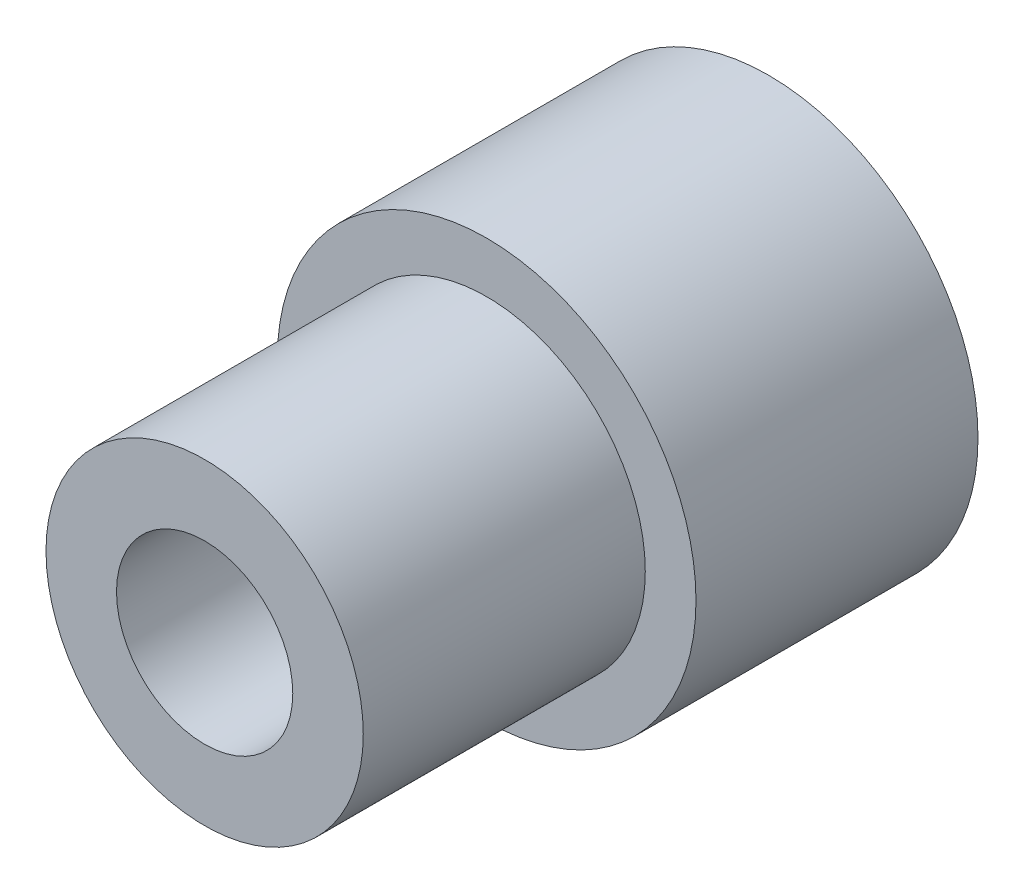
ISO-10303-21;
HEADER;
FILE_DESCRIPTION(('STEP AP214'),'2;1');
FILE_NAME('part.step','',(''),(''),'','','');
FILE_SCHEMA(('AUTOMOTIVE_DESIGN { 1 0 10303 214 1 1 1 1 }'));
ENDSEC;
DATA;
#1=APPLICATION_CONTEXT('core data for automotive mechanical design processes');
#2=APPLICATION_PROTOCOL_DEFINITION('international standard','automotive_design',2000,#1);
#3=PRODUCT_CONTEXT('',#1,'mechanical');
#4=PRODUCT('Part','Part','',(#3));
#5=PRODUCT_RELATED_PRODUCT_CATEGORY('part','',(#4));
#6=PRODUCT_DEFINITION_FORMATION('','',#4);
#7=PRODUCT_DEFINITION_CONTEXT('part definition',#1,'design');
#8=PRODUCT_DEFINITION('design','',#6,#7);
#9=PRODUCT_DEFINITION_SHAPE('','',#8);
#10=(LENGTH_UNIT() NAMED_UNIT(*) SI_UNIT(.MILLI.,.METRE.));
#11=(NAMED_UNIT(*) PLANE_ANGLE_UNIT() SI_UNIT($,.RADIAN.));
#12=(NAMED_UNIT(*) SI_UNIT($,.STERADIAN.) SOLID_ANGLE_UNIT());
#13=UNCERTAINTY_MEASURE_WITH_UNIT(LENGTH_MEASURE(1.E-05),#10,'distance_accuracy_value','');
#14=(GEOMETRIC_REPRESENTATION_CONTEXT(3) GLOBAL_UNCERTAINTY_ASSIGNED_CONTEXT((#13)) GLOBAL_UNIT_ASSIGNED_CONTEXT((#10,
#11,#12)) REPRESENTATION_CONTEXT('',''));
#15=CARTESIAN_POINT('',(0.,0.,0.));
#16=DIRECTION('',(0.,0.,1.));
#17=DIRECTION('',(1.,0.,0.));
#18=AXIS2_PLACEMENT_3D('',#15,#16,#17);
#19=CARTESIAN_POINT('',(0.,0.,5.08));
#20=DIRECTION('',(0.,0.,1.));
#21=DIRECTION('',(1.,0.,0.));
#22=AXIS2_PLACEMENT_3D('',#19,#20,#21);
#23=PLANE('',#22);
#24=CARTESIAN_POINT('',(0.,0.,5.08));
#25=DIRECTION('',(0.,0.,1.));
#26=DIRECTION('',(1.,0.,0.));
#27=AXIS2_PLACEMENT_3D('',#24,#25,#26);
#28=CIRCLE('',#27,2.8575);
#29=CARTESIAN_POINT('',(2.8575,0.,5.08));
#30=VERTEX_POINT('',#29);
#31=EDGE_CURVE('E50',#30,#30,#28,.T.);
#32=ORIENTED_EDGE('',*,*,#31,.F.);
#33=EDGE_LOOP('',(#32));
#34=FACE_BOUND('',#33,.T.);
#35=CARTESIAN_POINT('',(0.,0.,5.08));
#36=DIRECTION('',(0.,0.,1.));
#37=DIRECTION('',(1.,0.,0.));
#38=AXIS2_PLACEMENT_3D('',#35,#36,#37);
#39=CIRCLE('',#38,3.77063);
#40=CARTESIAN_POINT('',(3.77063,0.,5.08));
#41=VERTEX_POINT('',#40);
#42=EDGE_CURVE('E10',#41,#41,#39,.T.);
#43=ORIENTED_EDGE('',*,*,#42,.T.);
#44=EDGE_LOOP('',(#43));
#45=FACE_BOUND('',#44,.T.);
#46=ADVANCED_FACE('F31',(#34,#45),#23,.T.);
#47=CARTESIAN_POINT('',(0.,0.,0.));
#48=DIRECTION('',(0.,0.,1.));
#49=DIRECTION('',(1.,0.,0.));
#50=AXIS2_PLACEMENT_3D('',#47,#48,#49);
#51=PLANE('',#50);
#52=CARTESIAN_POINT('',(0.,0.,0.));
#53=DIRECTION('',(0.,0.,1.));
#54=DIRECTION('',(1.,0.,0.));
#55=AXIS2_PLACEMENT_3D('',#52,#53,#54);
#56=CIRCLE('',#55,3.77063);
#57=CARTESIAN_POINT('',(3.77063,0.,0.));
#58=VERTEX_POINT('',#57);
#59=EDGE_CURVE('E35',#58,#58,#56,.T.);
#60=ORIENTED_EDGE('',*,*,#59,.F.);
#61=EDGE_LOOP('',(#60));
#62=FACE_BOUND('',#61,.T.);
#63=CARTESIAN_POINT('',(0.,0.,0.));
#64=DIRECTION('',(0.,0.,1.));
#65=DIRECTION('',(1.,0.,0.));
#66=AXIS2_PLACEMENT_3D('',#63,#64,#65);
#67=CIRCLE('',#66,2.50063);
#68=CARTESIAN_POINT('',(2.50063,0.,0.));
#69=VERTEX_POINT('',#68);
#70=EDGE_CURVE('E42',#69,#69,#67,.T.);
#71=ORIENTED_EDGE('',*,*,#70,.T.);
#72=EDGE_LOOP('',(#71));
#73=FACE_BOUND('',#72,.T.);
#74=ADVANCED_FACE('F82',(#62,#73),#51,.F.);
#75=CARTESIAN_POINT('',(0.,0.,5.08));
#76=DIRECTION('',(0.,0.,-1.));
#77=DIRECTION('',(-1.,0.,0.));
#78=AXIS2_PLACEMENT_3D('',#75,#76,#77);
#79=CYLINDRICAL_SURFACE('',#78,3.77063);
#80=ORIENTED_EDGE('',*,*,#42,.F.);
#81=EDGE_LOOP('',(#80));
#82=FACE_BOUND('',#81,.T.);
#83=ORIENTED_EDGE('',*,*,#59,.T.);
#84=EDGE_LOOP('',(#83));
#85=FACE_BOUND('',#84,.T.);
#86=ADVANCED_FACE('F33',(#82,#85),#79,.T.);
#87=CARTESIAN_POINT('',(0.,0.,5.08));
#88=DIRECTION('',(0.,0.,-1.));
#89=DIRECTION('',(-1.,0.,0.));
#90=AXIS2_PLACEMENT_3D('',#87,#88,#89);
#91=CYLINDRICAL_SURFACE('',#90,2.50063);
#92=CARTESIAN_POINT('',(0.,0.,5.08));
#93=DIRECTION('',(0.,0.,1.));
#94=DIRECTION('',(1.,0.,0.));
#95=AXIS2_PLACEMENT_3D('',#92,#93,#94);
#96=CIRCLE('',#95,2.50063);
#97=CARTESIAN_POINT('',(2.50063,0.,5.08));
#98=VERTEX_POINT('',#97);
#99=EDGE_CURVE('E46',#98,#98,#96,.T.);
#100=ORIENTED_EDGE('',*,*,#99,.T.);
#101=EDGE_LOOP('',(#100));
#102=FACE_BOUND('',#101,.T.);
#103=ORIENTED_EDGE('',*,*,#70,.F.);
#104=EDGE_LOOP('',(#103));
#105=FACE_BOUND('',#104,.T.);
#106=ADVANCED_FACE('F77',(#102,#105),#91,.F.);
#107=CARTESIAN_POINT('',(0.,0.,5.08));
#108=DIRECTION('',(0.,0.,1.));
#109=DIRECTION('',(1.,0.,0.));
#110=AXIS2_PLACEMENT_3D('',#107,#108,#109);
#111=PLANE('',#110);
#112=CARTESIAN_POINT('',(0.,0.,5.08));
#113=DIRECTION('',(0.,0.,1.));
#114=DIRECTION('',(1.,0.,0.));
#115=AXIS2_PLACEMENT_3D('',#112,#113,#114);
#116=CIRCLE('',#115,1.5875);
#117=CARTESIAN_POINT('',(1.5875,0.,5.08));
#118=VERTEX_POINT('',#117);
#119=EDGE_CURVE('E56',#118,#118,#116,.T.);
#120=ORIENTED_EDGE('',*,*,#119,.T.);
#121=EDGE_LOOP('',(#120));
#122=FACE_BOUND('',#121,.T.);
#123=ORIENTED_EDGE('',*,*,#99,.F.);
#124=EDGE_LOOP('',(#123));
#125=FACE_BOUND('',#124,.T.);
#126=ADVANCED_FACE('F68',(#122,#125),#111,.F.);
#127=CARTESIAN_POINT('',(0.,0.,10.16));
#128=DIRECTION('',(0.,0.,1.));
#129=DIRECTION('',(1.,0.,0.));
#130=AXIS2_PLACEMENT_3D('',#127,#128,#129);
#131=PLANE('',#130);
#132=CARTESIAN_POINT('',(0.,0.,10.16));
#133=DIRECTION('',(0.,0.,1.));
#134=DIRECTION('',(1.,0.,0.));
#135=AXIS2_PLACEMENT_3D('',#132,#133,#134);
#136=CIRCLE('',#135,2.8575);
#137=CARTESIAN_POINT('',(2.8575,0.,10.16));
#138=VERTEX_POINT('',#137);
#139=EDGE_CURVE('E49',#138,#138,#136,.T.);
#140=ORIENTED_EDGE('',*,*,#139,.T.);
#141=EDGE_LOOP('',(#140));
#142=FACE_BOUND('',#141,.T.);
#143=CARTESIAN_POINT('',(0.,0.,10.16));
#144=DIRECTION('',(0.,0.,1.));
#145=DIRECTION('',(1.,0.,0.));
#146=AXIS2_PLACEMENT_3D('',#143,#144,#145);
#147=CIRCLE('',#146,1.5875);
#148=CARTESIAN_POINT('',(1.5875,0.,10.16));
#149=VERTEX_POINT('',#148);
#150=EDGE_CURVE('E53',#149,#149,#147,.T.);
#151=ORIENTED_EDGE('',*,*,#150,.F.);
#152=EDGE_LOOP('',(#151));
#153=FACE_BOUND('',#152,.T.);
#154=ADVANCED_FACE('F65',(#142,#153),#131,.T.);
#155=CARTESIAN_POINT('',(0.,0.,10.16));
#156=DIRECTION('',(0.,0.,-1.));
#157=DIRECTION('',(-1.,0.,0.));
#158=AXIS2_PLACEMENT_3D('',#155,#156,#157);
#159=CYLINDRICAL_SURFACE('',#158,2.8575);
#160=ORIENTED_EDGE('',*,*,#139,.F.);
#161=EDGE_LOOP('',(#160));
#162=FACE_BOUND('',#161,.T.);
#163=ORIENTED_EDGE('',*,*,#31,.T.);
#164=EDGE_LOOP('',(#163));
#165=FACE_BOUND('',#164,.T.);
#166=ADVANCED_FACE('F67',(#162,#165),#159,.T.);
#167=CARTESIAN_POINT('',(0.,0.,10.16));
#168=DIRECTION('',(0.,0.,-1.));
#169=DIRECTION('',(-1.,0.,0.));
#170=AXIS2_PLACEMENT_3D('',#167,#168,#169);
#171=CYLINDRICAL_SURFACE('',#170,1.5875);
#172=ORIENTED_EDGE('',*,*,#150,.T.);
#173=EDGE_LOOP('',(#172));
#174=FACE_BOUND('',#173,.T.);
#175=ORIENTED_EDGE('',*,*,#119,.F.);
#176=EDGE_LOOP('',(#175));
#177=FACE_BOUND('',#176,.T.);
#178=ADVANCED_FACE('F62',(#174,#177),#171,.F.);
#179=CLOSED_SHELL('',(#46,#74,#86,#106,#126,#154,#166,#178));
#180=MANIFOLD_SOLID_BREP('B2',#179);
#181=ADVANCED_BREP_SHAPE_REPRESENTATION('',(#18,#180),#14);
#182=SHAPE_DEFINITION_REPRESENTATION(#9,#181);
ENDSEC;
END-ISO-10303-21;
